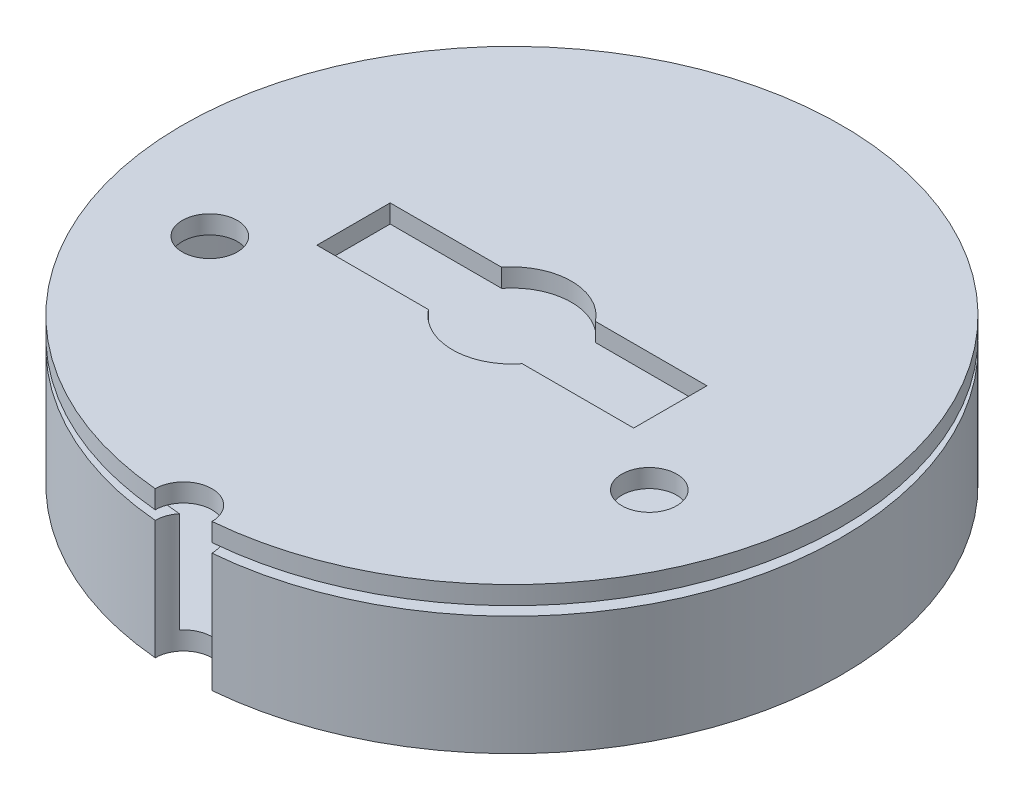
ISO-10303-21;
HEADER;
FILE_DESCRIPTION(('STEP AP214'),'2;1');
FILE_NAME('part.step','',(''),(''),'','','');
FILE_SCHEMA(('AUTOMOTIVE_DESIGN { 1 0 10303 214 1 1 1 1 }'));
ENDSEC;
DATA;
#1=APPLICATION_CONTEXT('core data for automotive mechanical design processes');
#2=APPLICATION_PROTOCOL_DEFINITION('international standard','automotive_design',2000,#1);
#3=PRODUCT_CONTEXT('',#1,'mechanical');
#4=PRODUCT('Part','Part','',(#3));
#5=PRODUCT_RELATED_PRODUCT_CATEGORY('part','',(#4));
#6=PRODUCT_DEFINITION_FORMATION('','',#4);
#7=PRODUCT_DEFINITION_CONTEXT('part definition',#1,'design');
#8=PRODUCT_DEFINITION('design','',#6,#7);
#9=PRODUCT_DEFINITION_SHAPE('','',#8);
#10=(LENGTH_UNIT() NAMED_UNIT(*) SI_UNIT(.MILLI.,.METRE.));
#11=(NAMED_UNIT(*) PLANE_ANGLE_UNIT() SI_UNIT($,.RADIAN.));
#12=(NAMED_UNIT(*) SI_UNIT($,.STERADIAN.) SOLID_ANGLE_UNIT());
#13=UNCERTAINTY_MEASURE_WITH_UNIT(LENGTH_MEASURE(1.E-05),#10,'distance_accuracy_value','');
#14=(GEOMETRIC_REPRESENTATION_CONTEXT(3) GLOBAL_UNCERTAINTY_ASSIGNED_CONTEXT((#13)) GLOBAL_UNIT_ASSIGNED_CONTEXT((#10,
#11,#12)) REPRESENTATION_CONTEXT('',''));
#15=CARTESIAN_POINT('',(0.,0.,0.));
#16=DIRECTION('',(0.,0.,1.));
#17=DIRECTION('',(1.,0.,0.));
#18=AXIS2_PLACEMENT_3D('',#15,#16,#17);
#19=CARTESIAN_POINT('',(0.,20.32,22.7750874367147));
#20=DIRECTION('',(0.,1.,0.));
#21=DIRECTION('',(0.,0.,1.));
#22=AXIS2_PLACEMENT_3D('',#19,#20,#21);
#23=PLANE('',#22);
#24=CARTESIAN_POINT('',(-30.48,20.32,11.43));
#25=DIRECTION('',(0.,1.,0.));
#26=DIRECTION('',(0.,0.,1.));
#27=AXIS2_PLACEMENT_3D('',#24,#25,#26);
#28=CIRCLE('',#27,3.81);
#29=CARTESIAN_POINT('',(-30.48,20.32,15.24));
#30=VERTEX_POINT('',#29);
#31=EDGE_CURVE('E141',#30,#30,#28,.F.);
#32=ORIENTED_EDGE('',*,*,#31,.T.);
#33=EDGE_LOOP('',(#32));
#34=FACE_BOUND('',#33,.T.);
#35=CARTESIAN_POINT('',(30.48,20.32,11.43));
#36=DIRECTION('',(0.,1.,0.));
#37=DIRECTION('',(0.,0.,1.));
#38=AXIS2_PLACEMENT_3D('',#35,#36,#37);
#39=CIRCLE('',#38,3.81);
#40=CARTESIAN_POINT('',(30.48,20.32,15.24));
#41=VERTEX_POINT('',#40);
#42=EDGE_CURVE('E164',#41,#41,#39,.F.);
#43=ORIENTED_EDGE('',*,*,#42,.T.);
#44=EDGE_LOOP('',(#43));
#45=FACE_BOUND('',#44,.T.);
#46=CARTESIAN_POINT('',(0.,20.32,45.5501748734294));
#47=DIRECTION('',(0.,-1.,0.));
#48=DIRECTION('',(0.,0.,1.));
#49=AXIS2_PLACEMENT_3D('',#46,#47,#48);
#50=CIRCLE('',#49,3.937);
#51=CARTESIAN_POINT('',(-3.93700000000001,20.32,45.5501748734294));
#52=VERTEX_POINT('',#51);
#53=CARTESIAN_POINT('',(3.937,20.32,45.5501748734294));
#54=VERTEX_POINT('',#53);
#55=EDGE_CURVE('E208',#52,#54,#50,.T.);
#56=ORIENTED_EDGE('',*,*,#55,.T.);
#57=CARTESIAN_POINT('',(0.,20.32,0.));
#58=DIRECTION('',(0.,1.,0.));
#59=DIRECTION('',(0.,0.,1.));
#60=AXIS2_PLACEMENT_3D('',#57,#58,#59);
#61=CIRCLE('',#60,45.72);
#62=EDGE_CURVE('E144',#54,#52,#61,.T.);
#63=ORIENTED_EDGE('',*,*,#62,.T.);
#64=EDGE_LOOP('',(#56,#63));
#65=FACE_BOUND('',#64,.T.);
#66=CARTESIAN_POINT('',(0.,20.32,0.));
#67=DIRECTION('',(0.,1.,0.));
#68=DIRECTION('',(0.,0.,1.));
#69=AXIS2_PLACEMENT_3D('',#66,#67,#68);
#70=CIRCLE('',#69,8.255);
#71=CARTESIAN_POINT('',(-6.50681373638434,20.32,-5.08));
#72=VERTEX_POINT('',#71);
#73=CARTESIAN_POINT('',(6.50681373638434,20.32,-5.08));
#74=VERTEX_POINT('',#73);
#75=EDGE_CURVE('E156',#72,#74,#70,.F.);
#76=ORIENTED_EDGE('',*,*,#75,.T.);
#77=DIRECTION('',(1.,0.,0.));
#78=VECTOR('',#77,1.);
#79=CARTESIAN_POINT('',(0.,20.32,-5.08));
#80=LINE('',#79,#78);
#81=CARTESIAN_POINT('',(21.971,20.32,-5.08));
#82=VERTEX_POINT('',#81);
#83=EDGE_CURVE('E199',#74,#82,#80,.T.);
#84=ORIENTED_EDGE('',*,*,#83,.T.);
#85=DIRECTION('',(0.,0.,1.));
#86=VECTOR('',#85,1.);
#87=CARTESIAN_POINT('',(21.971,20.32,22.7750874367147));
#88=LINE('',#87,#86);
#89=CARTESIAN_POINT('',(21.971,20.32,5.08));
#90=VERTEX_POINT('',#89);
#91=EDGE_CURVE('E159',#82,#90,#88,.T.);
#92=ORIENTED_EDGE('',*,*,#91,.T.);
#93=DIRECTION('',(-1.,0.,0.));
#94=VECTOR('',#93,1.);
#95=CARTESIAN_POINT('',(0.,20.32,5.08));
#96=LINE('',#95,#94);
#97=CARTESIAN_POINT('',(6.50681373638434,20.32,5.08));
#98=VERTEX_POINT('',#97);
#99=EDGE_CURVE('E190',#90,#98,#96,.T.);
#100=ORIENTED_EDGE('',*,*,#99,.T.);
#101=CARTESIAN_POINT('',(-6.50681373638434,20.32,5.08));
#102=VERTEX_POINT('',#101);
#103=EDGE_CURVE('E134',#98,#102,#70,.F.);
#104=ORIENTED_EDGE('',*,*,#103,.T.);
#105=CARTESIAN_POINT('',(-21.971,20.32,5.08));
#106=VERTEX_POINT('',#105);
#107=EDGE_CURVE('E186',#102,#106,#96,.T.);
#108=ORIENTED_EDGE('',*,*,#107,.T.);
#109=DIRECTION('',(0.,0.,-1.));
#110=VECTOR('',#109,1.);
#111=CARTESIAN_POINT('',(-21.971,20.32,22.7750874367147));
#112=LINE('',#111,#110);
#113=CARTESIAN_POINT('',(-21.971,20.32,-5.08));
#114=VERTEX_POINT('',#113);
#115=EDGE_CURVE('E193',#106,#114,#112,.T.);
#116=ORIENTED_EDGE('',*,*,#115,.T.);
#117=EDGE_CURVE('E203',#114,#72,#80,.T.);
#118=ORIENTED_EDGE('',*,*,#117,.T.);
#119=EDGE_LOOP('',(#76,#84,#92,#100,#104,#108,#116,#118));
#120=FACE_BOUND('',#119,.T.);
#121=ADVANCED_FACE('F46',(#34,#45,#65,#120),#23,.T.);
#122=CARTESIAN_POINT('',(21.971,38.608,5.08));
#123=DIRECTION('',(-1.,0.,0.));
#124=DIRECTION('',(0.,0.,1.));
#125=AXIS2_PLACEMENT_3D('',#122,#123,#124);
#126=PLANE('',#125);
#127=DIRECTION('',(0.,-1.,0.));
#128=VECTOR('',#127,1.);
#129=CARTESIAN_POINT('',(21.971,38.608,-5.08));
#130=LINE('',#129,#128);
#131=CARTESIAN_POINT('',(21.971,17.78,-5.08));
#132=VERTEX_POINT('',#131);
#133=EDGE_CURVE('E182',#82,#132,#130,.T.);
#134=ORIENTED_EDGE('',*,*,#133,.T.);
#135=DIRECTION('',(0.,0.,1.));
#136=VECTOR('',#135,1.);
#137=CARTESIAN_POINT('',(21.971,17.78,0.));
#138=LINE('',#137,#136);
#139=CARTESIAN_POINT('',(21.971,17.78,5.08));
#140=VERTEX_POINT('',#139);
#141=EDGE_CURVE('E55',#132,#140,#138,.T.);
#142=ORIENTED_EDGE('',*,*,#141,.T.);
#143=DIRECTION('',(0.,-1.,0.));
#144=VECTOR('',#143,1.);
#145=CARTESIAN_POINT('',(21.971,38.608,5.08));
#146=LINE('',#145,#144);
#147=EDGE_CURVE('E64',#90,#140,#146,.T.);
#148=ORIENTED_EDGE('',*,*,#147,.F.);
#149=ORIENTED_EDGE('',*,*,#91,.F.);
#150=EDGE_LOOP('',(#134,#142,#148,#149));
#151=FACE_BOUND('',#150,.T.);
#152=ADVANCED_FACE('F212',(#151),#126,.T.);
#153=CARTESIAN_POINT('',(-21.971,38.608,5.08));
#154=DIRECTION('',(0.,0.,-1.));
#155=DIRECTION('',(-1.,0.,0.));
#156=AXIS2_PLACEMENT_3D('',#153,#154,#155);
#157=PLANE('',#156);
#158=ORIENTED_EDGE('',*,*,#147,.T.);
#159=DIRECTION('',(-1.,0.,0.));
#160=VECTOR('',#159,1.);
#161=CARTESIAN_POINT('',(0.,17.78,5.08));
#162=LINE('',#161,#160);
#163=CARTESIAN_POINT('',(6.50681373638435,17.78,5.08));
#164=VERTEX_POINT('',#163);
#165=EDGE_CURVE('E150',#140,#164,#162,.T.);
#166=ORIENTED_EDGE('',*,*,#165,.T.);
#167=DIRECTION('',(0.,-1.,0.));
#168=VECTOR('',#167,1.);
#169=CARTESIAN_POINT('',(6.50681373638434,50.038,5.08));
#170=LINE('',#169,#168);
#171=EDGE_CURVE('E189',#98,#164,#170,.T.);
#172=ORIENTED_EDGE('',*,*,#171,.F.);
#173=ORIENTED_EDGE('',*,*,#99,.F.);
#174=EDGE_LOOP('',(#158,#166,#172,#173));
#175=FACE_BOUND('',#174,.T.);
#176=ADVANCED_FACE('F262',(#175),#157,.T.);
#177=CARTESIAN_POINT('',(0.,50.038,0.));
#178=DIRECTION('',(0.,-1.,0.));
#179=DIRECTION('',(0.,0.,-1.));
#180=AXIS2_PLACEMENT_3D('',#177,#178,#179);
#181=CYLINDRICAL_SURFACE('',#180,8.255);
#182=ORIENTED_EDGE('',*,*,#103,.F.);
#183=ORIENTED_EDGE('',*,*,#171,.T.);
#184=CARTESIAN_POINT('',(0.,17.78,0.));
#185=DIRECTION('',(0.,1.,0.));
#186=DIRECTION('',(0.,0.,1.));
#187=AXIS2_PLACEMENT_3D('',#184,#185,#186);
#188=CIRCLE('',#187,8.255);
#189=CARTESIAN_POINT('',(-6.50681373638435,17.78,5.08));
#190=VERTEX_POINT('',#189);
#191=EDGE_CURVE('E157',#190,#164,#188,.T.);
#192=ORIENTED_EDGE('',*,*,#191,.F.);
#193=DIRECTION('',(0.,-1.,0.));
#194=VECTOR('',#193,1.);
#195=CARTESIAN_POINT('',(-6.50681373638434,50.038,5.08));
#196=LINE('',#195,#194);
#197=EDGE_CURVE('E72',#190,#102,#196,.F.);
#198=ORIENTED_EDGE('',*,*,#197,.T.);
#199=EDGE_LOOP('',(#182,#183,#192,#198));
#200=FACE_BOUND('',#199,.T.);
#201=ADVANCED_FACE('F233',(#200),#181,.F.);
#202=ORIENTED_EDGE('',*,*,#197,.F.);
#203=CARTESIAN_POINT('',(-21.971,17.78,5.08));
#204=VERTEX_POINT('',#203);
#205=EDGE_CURVE('E146',#190,#204,#162,.T.);
#206=ORIENTED_EDGE('',*,*,#205,.T.);
#207=DIRECTION('',(0.,-1.,0.));
#208=VECTOR('',#207,1.);
#209=CARTESIAN_POINT('',(-21.971,38.608,5.08));
#210=LINE('',#209,#208);
#211=EDGE_CURVE('E176',#106,#204,#210,.T.);
#212=ORIENTED_EDGE('',*,*,#211,.F.);
#213=ORIENTED_EDGE('',*,*,#107,.F.);
#214=EDGE_LOOP('',(#202,#206,#212,#213));
#215=FACE_BOUND('',#214,.T.);
#216=ADVANCED_FACE('F237',(#215),#157,.T.);
#217=CARTESIAN_POINT('',(-21.971,38.608,5.08));
#218=DIRECTION('',(1.,0.,0.));
#219=DIRECTION('',(0.,0.,-1.));
#220=AXIS2_PLACEMENT_3D('',#217,#218,#219);
#221=PLANE('',#220);
#222=ORIENTED_EDGE('',*,*,#211,.T.);
#223=DIRECTION('',(0.,0.,-1.));
#224=VECTOR('',#223,1.);
#225=CARTESIAN_POINT('',(-21.971,17.78,0.));
#226=LINE('',#225,#224);
#227=CARTESIAN_POINT('',(-21.971,17.78,-5.08));
#228=VERTEX_POINT('',#227);
#229=EDGE_CURVE('E148',#204,#228,#226,.T.);
#230=ORIENTED_EDGE('',*,*,#229,.T.);
#231=DIRECTION('',(0.,-1.,0.));
#232=VECTOR('',#231,1.);
#233=CARTESIAN_POINT('',(-21.971,38.608,-5.08));
#234=LINE('',#233,#232);
#235=EDGE_CURVE('E179',#114,#228,#234,.T.);
#236=ORIENTED_EDGE('',*,*,#235,.F.);
#237=ORIENTED_EDGE('',*,*,#115,.F.);
#238=EDGE_LOOP('',(#222,#230,#236,#237));
#239=FACE_BOUND('',#238,.T.);
#240=ADVANCED_FACE('F239',(#239),#221,.T.);
#241=CARTESIAN_POINT('',(-21.971,38.608,-5.08));
#242=DIRECTION('',(0.,0.,1.));
#243=DIRECTION('',(1.,0.,0.));
#244=AXIS2_PLACEMENT_3D('',#241,#242,#243);
#245=PLANE('',#244);
#246=ORIENTED_EDGE('',*,*,#235,.T.);
#247=DIRECTION('',(1.,0.,0.));
#248=VECTOR('',#247,1.);
#249=CARTESIAN_POINT('',(0.,17.78,-5.08));
#250=LINE('',#249,#248);
#251=CARTESIAN_POINT('',(-6.50681373638434,17.78,-5.08));
#252=VERTEX_POINT('',#251);
#253=EDGE_CURVE('E57',#228,#252,#250,.T.);
#254=ORIENTED_EDGE('',*,*,#253,.T.);
#255=DIRECTION('',(0.,-1.,0.));
#256=VECTOR('',#255,1.);
#257=CARTESIAN_POINT('',(-6.50681373638434,50.038,-5.08));
#258=LINE('',#257,#256);
#259=EDGE_CURVE('E202',#72,#252,#258,.T.);
#260=ORIENTED_EDGE('',*,*,#259,.F.);
#261=ORIENTED_EDGE('',*,*,#117,.F.);
#262=EDGE_LOOP('',(#246,#254,#260,#261));
#263=FACE_BOUND('',#262,.T.);
#264=ADVANCED_FACE('F242',(#263),#245,.T.);
#265=ORIENTED_EDGE('',*,*,#75,.F.);
#266=ORIENTED_EDGE('',*,*,#259,.T.);
#267=CARTESIAN_POINT('',(6.50681373638434,17.78,-5.08));
#268=VERTEX_POINT('',#267);
#269=EDGE_CURVE('E135',#268,#252,#188,.T.);
#270=ORIENTED_EDGE('',*,*,#269,.F.);
#271=DIRECTION('',(0.,-1.,0.));
#272=VECTOR('',#271,1.);
#273=CARTESIAN_POINT('',(6.50681373638434,50.038,-5.08));
#274=LINE('',#273,#272);
#275=EDGE_CURVE('E196',#268,#74,#274,.F.);
#276=ORIENTED_EDGE('',*,*,#275,.T.);
#277=EDGE_LOOP('',(#265,#266,#270,#276));
#278=FACE_BOUND('',#277,.T.);
#279=ADVANCED_FACE('F219',(#278),#181,.F.);
#280=ORIENTED_EDGE('',*,*,#275,.F.);
#281=EDGE_CURVE('E13',#268,#132,#250,.T.);
#282=ORIENTED_EDGE('',*,*,#281,.T.);
#283=ORIENTED_EDGE('',*,*,#133,.F.);
#284=ORIENTED_EDGE('',*,*,#83,.F.);
#285=EDGE_LOOP('',(#280,#282,#283,#284));
#286=FACE_BOUND('',#285,.T.);
#287=ADVANCED_FACE('F224',(#286),#245,.T.);
#288=CARTESIAN_POINT('',(0.,20.32,0.));
#289=DIRECTION('',(0.,-1.,0.));
#290=DIRECTION('',(0.,0.,-1.));
#291=AXIS2_PLACEMENT_3D('',#288,#289,#290);
#292=CYLINDRICAL_SURFACE('',#291,45.72);
#293=CARTESIAN_POINT('',(0.,17.78,0.));
#294=DIRECTION('',(0.,-1.,0.));
#295=DIRECTION('',(0.,0.,-1.));
#296=AXIS2_PLACEMENT_3D('',#293,#294,#295);
#297=CIRCLE('',#296,45.72);
#298=CARTESIAN_POINT('',(-3.937,17.78,45.5501748734294));
#299=VERTEX_POINT('',#298);
#300=CARTESIAN_POINT('',(3.937,17.78,45.5501748734294));
#301=VERTEX_POINT('',#300);
#302=EDGE_CURVE('E137',#299,#301,#297,.T.);
#303=ORIENTED_EDGE('',*,*,#302,.F.);
#304=DIRECTION('',(0.,-1.,0.));
#305=VECTOR('',#304,1.);
#306=CARTESIAN_POINT('',(-3.93700000000001,20.32,45.5501748734294));
#307=LINE('',#306,#305);
#308=EDGE_CURVE('E131',#52,#299,#307,.T.);
#309=ORIENTED_EDGE('',*,*,#308,.F.);
#310=ORIENTED_EDGE('',*,*,#62,.F.);
#311=DIRECTION('',(0.,-1.,0.));
#312=VECTOR('',#311,1.);
#313=CARTESIAN_POINT('',(3.937,20.32,45.5501748734294));
#314=LINE('',#313,#312);
#315=EDGE_CURVE('E129',#54,#301,#314,.T.);
#316=ORIENTED_EDGE('',*,*,#315,.T.);
#317=EDGE_LOOP('',(#303,#309,#310,#316));
#318=FACE_BOUND('',#317,.T.);
#319=ADVANCED_FACE('F143',(#318),#292,.T.);
#320=CARTESIAN_POINT('',(0.,17.78,0.));
#321=DIRECTION('',(0.,1.,0.));
#322=DIRECTION('',(0.,0.,1.));
#323=AXIS2_PLACEMENT_3D('',#320,#321,#322);
#324=PLANE('',#323);
#325=CARTESIAN_POINT('',(-30.48,17.78,11.43));
#326=DIRECTION('',(0.,1.,0.));
#327=DIRECTION('',(0.,0.,1.));
#328=AXIS2_PLACEMENT_3D('',#325,#326,#327);
#329=CIRCLE('',#328,3.81);
#330=CARTESIAN_POINT('',(-30.48,17.78,15.24));
#331=VERTEX_POINT('',#330);
#332=EDGE_CURVE('E50',#331,#331,#329,.F.);
#333=ORIENTED_EDGE('',*,*,#332,.F.);
#334=EDGE_LOOP('',(#333));
#335=FACE_BOUND('',#334,.T.);
#336=CARTESIAN_POINT('',(30.48,17.78,11.43));
#337=DIRECTION('',(0.,1.,0.));
#338=DIRECTION('',(0.,0.,1.));
#339=AXIS2_PLACEMENT_3D('',#336,#337,#338);
#340=CIRCLE('',#339,3.81);
#341=CARTESIAN_POINT('',(30.48,17.78,15.24));
#342=VERTEX_POINT('',#341);
#343=EDGE_CURVE('E162',#342,#342,#340,.F.);
#344=ORIENTED_EDGE('',*,*,#343,.F.);
#345=EDGE_LOOP('',(#344));
#346=FACE_BOUND('',#345,.T.);
#347=CARTESIAN_POINT('',(0.,17.78,45.5501748734294));
#348=DIRECTION('',(0.,1.,0.));
#349=DIRECTION('',(0.,0.,1.));
#350=AXIS2_PLACEMENT_3D('',#347,#348,#349);
#351=CIRCLE('',#350,3.937);
#352=EDGE_CURVE('E125',#299,#301,#351,.F.);
#353=ORIENTED_EDGE('',*,*,#352,.F.);
#354=ORIENTED_EDGE('',*,*,#302,.T.);
#355=EDGE_LOOP('',(#353,#354));
#356=FACE_BOUND('',#355,.T.);
#357=ORIENTED_EDGE('',*,*,#281,.F.);
#358=ORIENTED_EDGE('',*,*,#269,.T.);
#359=ORIENTED_EDGE('',*,*,#253,.F.);
#360=ORIENTED_EDGE('',*,*,#229,.F.);
#361=ORIENTED_EDGE('',*,*,#205,.F.);
#362=ORIENTED_EDGE('',*,*,#191,.T.);
#363=ORIENTED_EDGE('',*,*,#165,.F.);
#364=ORIENTED_EDGE('',*,*,#141,.F.);
#365=EDGE_LOOP('',(#357,#358,#359,#360,#361,#362,#363,#364));
#366=FACE_BOUND('',#365,.T.);
#367=ADVANCED_FACE('F138',(#335,#346,#356,#366),#324,.F.);
#368=CARTESIAN_POINT('',(0.,20.32,45.5501748734294));
#369=DIRECTION('',(0.,-1.,0.));
#370=DIRECTION('',(0.,0.,-1.));
#371=AXIS2_PLACEMENT_3D('',#368,#369,#370);
#372=CYLINDRICAL_SURFACE('',#371,3.937);
#373=ORIENTED_EDGE('',*,*,#308,.T.);
#374=ORIENTED_EDGE('',*,*,#352,.T.);
#375=ORIENTED_EDGE('',*,*,#315,.F.);
#376=ORIENTED_EDGE('',*,*,#55,.F.);
#377=EDGE_LOOP('',(#373,#374,#375,#376));
#378=FACE_BOUND('',#377,.T.);
#379=ADVANCED_FACE('F48',(#378),#372,.F.);
#380=CARTESIAN_POINT('',(30.48,39.37,11.43));
#381=DIRECTION('',(0.,-1.,0.));
#382=DIRECTION('',(0.,0.,-1.));
#383=AXIS2_PLACEMENT_3D('',#380,#381,#382);
#384=CYLINDRICAL_SURFACE('',#383,3.81);
#385=ORIENTED_EDGE('',*,*,#42,.F.);
#386=EDGE_LOOP('',(#385));
#387=FACE_BOUND('',#386,.T.);
#388=ORIENTED_EDGE('',*,*,#343,.T.);
#389=EDGE_LOOP('',(#388));
#390=FACE_BOUND('',#389,.T.);
#391=ADVANCED_FACE('F316',(#387,#390),#384,.F.);
#392=CARTESIAN_POINT('',(-30.48,39.37,11.43));
#393=DIRECTION('',(0.,-1.,0.));
#394=DIRECTION('',(0.,0.,-1.));
#395=AXIS2_PLACEMENT_3D('',#392,#393,#394);
#396=CYLINDRICAL_SURFACE('',#395,3.81);
#397=ORIENTED_EDGE('',*,*,#31,.F.);
#398=EDGE_LOOP('',(#397));
#399=FACE_BOUND('',#398,.T.);
#400=ORIENTED_EDGE('',*,*,#332,.T.);
#401=EDGE_LOOP('',(#400));
#402=FACE_BOUND('',#401,.T.);
#403=ADVANCED_FACE('F323',(#399,#402),#396,.F.);
#404=CLOSED_SHELL('',(#121,#152,#176,#201,#216,#240,#264,#279,#287,#319,#367,#379,#391,#403));
#405=MANIFOLD_SOLID_BREP('B2',#404);
#406=CARTESIAN_POINT('',(0.,20.32,45.5501748734294));
#407=DIRECTION('',(0.,-1.,0.));
#408=DIRECTION('',(0.,0.,-1.));
#409=AXIS2_PLACEMENT_3D('',#406,#407,#408);
#410=CYLINDRICAL_SURFACE('',#409,3.937);
#411=CARTESIAN_POINT('',(0.,16.51,45.5501748734294));
#412=DIRECTION('',(0.,1.,0.));
#413=DIRECTION('',(0.,0.,1.));
#414=AXIS2_PLACEMENT_3D('',#411,#412,#413);
#415=CIRCLE('',#414,3.937);
#416=CARTESIAN_POINT('',(-3.937,16.51,45.5501748734294));
#417=VERTEX_POINT('',#416);
#418=CARTESIAN_POINT('',(-3.058799887373,16.51,43.0715235770573));
#419=VERTEX_POINT('',#418);
#420=EDGE_CURVE('E378',#417,#419,#415,.F.);
#421=ORIENTED_EDGE('',*,*,#420,.F.);
#422=DIRECTION('',(0.,-1.,0.));
#423=VECTOR('',#422,1.);
#424=CARTESIAN_POINT('',(-3.93700000000001,20.32,45.5501748734294));
#425=LINE('',#424,#423);
#426=CARTESIAN_POINT('',(-3.93700000000001,0.,45.5501748734294));
#427=VERTEX_POINT('',#426);
#428=EDGE_CURVE('E434',#417,#427,#425,.T.);
#429=ORIENTED_EDGE('',*,*,#428,.T.);
#430=CARTESIAN_POINT('',(0.,0.,45.5501748734294));
#431=DIRECTION('',(0.,-1.,0.));
#432=DIRECTION('',(0.,0.,1.));
#433=AXIS2_PLACEMENT_3D('',#430,#431,#432);
#434=CIRCLE('',#433,3.937);
#435=CARTESIAN_POINT('',(3.937,0.,45.5501748734294));
#436=VERTEX_POINT('',#435);
#437=EDGE_CURVE('E423',#427,#436,#434,.T.);
#438=ORIENTED_EDGE('',*,*,#437,.T.);
#439=DIRECTION('',(0.,-1.,0.));
#440=VECTOR('',#439,1.);
#441=CARTESIAN_POINT('',(3.937,20.32,45.5501748734294));
#442=LINE('',#441,#440);
#443=CARTESIAN_POINT('',(3.937,16.51,45.5501748734294));
#444=VERTEX_POINT('',#443);
#445=EDGE_CURVE('E419',#444,#436,#442,.T.);
#446=ORIENTED_EDGE('',*,*,#445,.F.);
#447=CARTESIAN_POINT('',(3.05879988737297,16.51,43.0715235770573));
#448=VERTEX_POINT('',#447);
#449=EDGE_CURVE('E44',#448,#444,#415,.F.);
#450=ORIENTED_EDGE('',*,*,#449,.F.);
#451=DIRECTION('',(0.,1.,0.));
#452=VECTOR('',#451,1.);
#453=CARTESIAN_POINT('',(3.058799887373,10.16,43.0715235770573));
#454=LINE('',#453,#452);
#455=CARTESIAN_POINT('',(3.05879988737294,2.54,43.0715235770573));
#456=VERTEX_POINT('',#455);
#457=EDGE_CURVE('E414',#448,#456,#454,.F.);
#458=ORIENTED_EDGE('',*,*,#457,.T.);
#459=CARTESIAN_POINT('',(0.,2.54,45.5501748734294));
#460=DIRECTION('',(0.,1.,0.));
#461=DIRECTION('',(0.,0.,1.));
#462=AXIS2_PLACEMENT_3D('',#459,#460,#461);
#463=CIRCLE('',#462,3.937);
#464=CARTESIAN_POINT('',(-3.05879988737294,2.54,43.0715235770573));
#465=VERTEX_POINT('',#464);
#466=EDGE_CURVE('E418',#465,#456,#463,.F.);
#467=ORIENTED_EDGE('',*,*,#466,.F.);
#468=DIRECTION('',(0.,1.,0.));
#469=VECTOR('',#468,1.);
#470=CARTESIAN_POINT('',(-3.058799887373,10.16,43.0715235770573));
#471=LINE('',#470,#469);
#472=EDGE_CURVE('E412',#465,#419,#471,.T.);
#473=ORIENTED_EDGE('',*,*,#472,.T.);
#474=EDGE_LOOP('',(#421,#429,#438,#446,#450,#458,#467,#473));
#475=FACE_BOUND('',#474,.T.);
#476=ADVANCED_FACE('F367',(#475),#410,.F.);
#477=CARTESIAN_POINT('',(0.,20.32,0.));
#478=DIRECTION('',(0.,-1.,0.));
#479=DIRECTION('',(0.,0.,-1.));
#480=AXIS2_PLACEMENT_3D('',#477,#478,#479);
#481=CYLINDRICAL_SURFACE('',#480,45.72);
#482=CARTESIAN_POINT('',(0.,16.51,0.));
#483=DIRECTION('',(0.,1.,0.));
#484=DIRECTION('',(0.,0.,1.));
#485=AXIS2_PLACEMENT_3D('',#482,#483,#484);
#486=CIRCLE('',#485,45.72);
#487=EDGE_CURVE('E404',#444,#417,#486,.T.);
#488=ORIENTED_EDGE('',*,*,#487,.F.);
#489=ORIENTED_EDGE('',*,*,#445,.T.);
#490=CARTESIAN_POINT('',(0.,0.,0.));
#491=DIRECTION('',(0.,1.,0.));
#492=DIRECTION('',(0.,0.,1.));
#493=AXIS2_PLACEMENT_3D('',#490,#491,#492);
#494=CIRCLE('',#493,45.72);
#495=EDGE_CURVE('E421',#436,#427,#494,.T.);
#496=ORIENTED_EDGE('',*,*,#495,.T.);
#497=ORIENTED_EDGE('',*,*,#428,.F.);
#498=EDGE_LOOP('',(#488,#489,#496,#497));
#499=FACE_BOUND('',#498,.T.);
#500=ADVANCED_FACE('F480',(#499),#481,.T.);
#501=CARTESIAN_POINT('',(0.,2.54,0.));
#502=DIRECTION('',(0.,1.,0.));
#503=DIRECTION('',(0.,0.,1.));
#504=AXIS2_PLACEMENT_3D('',#501,#502,#503);
#505=CYLINDRICAL_SURFACE('',#504,43.18);
#506=CARTESIAN_POINT('',(0.,16.51,0.));
#507=DIRECTION('',(0.,1.,0.));
#508=DIRECTION('',(0.,0.,1.));
#509=AXIS2_PLACEMENT_3D('',#506,#507,#508);
#510=CIRCLE('',#509,43.18);
#511=EDGE_CURVE('E376',#419,#448,#510,.F.);
#512=ORIENTED_EDGE('',*,*,#511,.F.);
#513=ORIENTED_EDGE('',*,*,#472,.F.);
#514=CARTESIAN_POINT('',(0.,2.54,0.));
#515=DIRECTION('',(0.,1.,0.));
#516=DIRECTION('',(0.,0.,1.));
#517=AXIS2_PLACEMENT_3D('',#514,#515,#516);
#518=CIRCLE('',#517,43.18);
#519=EDGE_CURVE('E438',#456,#465,#518,.T.);
#520=ORIENTED_EDGE('',*,*,#519,.F.);
#521=ORIENTED_EDGE('',*,*,#457,.F.);
#522=EDGE_LOOP('',(#512,#513,#520,#521));
#523=FACE_BOUND('',#522,.T.);
#524=ADVANCED_FACE('F410',(#523),#505,.F.);
#525=CARTESIAN_POINT('',(0.,20.32,0.));
#526=DIRECTION('',(0.,-1.,0.));
#527=DIRECTION('',(0.,0.,-1.));
#528=AXIS2_PLACEMENT_3D('',#525,#526,#527);
#529=CYLINDRICAL_SURFACE('',#528,5.588);
#530=CARTESIAN_POINT('',(0.,0.,0.));
#531=DIRECTION('',(0.,1.,0.));
#532=DIRECTION('',(0.,0.,1.));
#533=AXIS2_PLACEMENT_3D('',#530,#531,#532);
#534=CIRCLE('',#533,5.588);
#535=CARTESIAN_POINT('',(0.,0.,5.588));
#536=VERTEX_POINT('',#535);
#537=EDGE_CURVE('E429',#536,#536,#534,.T.);
#538=ORIENTED_EDGE('',*,*,#537,.F.);
#539=EDGE_LOOP('',(#538));
#540=FACE_BOUND('',#539,.T.);
#541=CARTESIAN_POINT('',(0.,2.54,0.));
#542=DIRECTION('',(0.,1.,0.));
#543=DIRECTION('',(0.,0.,1.));
#544=AXIS2_PLACEMENT_3D('',#541,#542,#543);
#545=CIRCLE('',#544,5.588);
#546=CARTESIAN_POINT('',(0.,2.54,5.588));
#547=VERTEX_POINT('',#546);
#548=EDGE_CURVE('E426',#547,#547,#545,.T.);
#549=ORIENTED_EDGE('',*,*,#548,.T.);
#550=EDGE_LOOP('',(#549));
#551=FACE_BOUND('',#550,.T.);
#552=ADVANCED_FACE('F488',(#540,#551),#529,.F.);
#553=CARTESIAN_POINT('',(0.,0.,22.7750874367147));
#554=DIRECTION('',(0.,1.,0.));
#555=DIRECTION('',(0.,0.,1.));
#556=AXIS2_PLACEMENT_3D('',#553,#554,#555);
#557=PLANE('',#556);
#558=CARTESIAN_POINT('',(-30.48,0.,11.43));
#559=DIRECTION('',(0.,1.,0.));
#560=DIRECTION('',(0.,0.,1.));
#561=AXIS2_PLACEMENT_3D('',#558,#559,#560);
#562=CIRCLE('',#561,3.81);
#563=CARTESIAN_POINT('',(-30.48,0.,15.24));
#564=VERTEX_POINT('',#563);
#565=EDGE_CURVE('E443',#564,#564,#562,.T.);
#566=ORIENTED_EDGE('',*,*,#565,.T.);
#567=EDGE_LOOP('',(#566));
#568=FACE_BOUND('',#567,.T.);
#569=CARTESIAN_POINT('',(30.48,0.,11.43));
#570=DIRECTION('',(0.,1.,0.));
#571=DIRECTION('',(0.,0.,-1.));
#572=AXIS2_PLACEMENT_3D('',#569,#570,#571);
#573=CIRCLE('',#572,3.81);
#574=CARTESIAN_POINT('',(30.48,0.,7.62));
#575=VERTEX_POINT('',#574);
#576=EDGE_CURVE('E448',#575,#575,#573,.T.);
#577=ORIENTED_EDGE('',*,*,#576,.T.);
#578=EDGE_LOOP('',(#577));
#579=FACE_BOUND('',#578,.T.);
#580=ORIENTED_EDGE('',*,*,#437,.F.);
#581=ORIENTED_EDGE('',*,*,#495,.F.);
#582=EDGE_LOOP('',(#580,#581));
#583=FACE_BOUND('',#582,.T.);
#584=ORIENTED_EDGE('',*,*,#537,.T.);
#585=EDGE_LOOP('',(#584));
#586=FACE_BOUND('',#585,.T.);
#587=ADVANCED_FACE('F456',(#568,#579,#583,#586),#557,.F.);
#588=CARTESIAN_POINT('',(0.,2.54,0.));
#589=DIRECTION('',(0.,1.,0.));
#590=DIRECTION('',(0.,0.,1.));
#591=AXIS2_PLACEMENT_3D('',#588,#589,#590);
#592=PLANE('',#591);
#593=CARTESIAN_POINT('',(-30.48,2.54,11.43));
#594=DIRECTION('',(0.,1.,0.));
#595=DIRECTION('',(0.,0.,1.));
#596=AXIS2_PLACEMENT_3D('',#593,#594,#595);
#597=CIRCLE('',#596,3.81);
#598=CARTESIAN_POINT('',(-30.48,2.54,15.24));
#599=VERTEX_POINT('',#598);
#600=EDGE_CURVE('E370',#599,#599,#597,.F.);
#601=ORIENTED_EDGE('',*,*,#600,.T.);
#602=EDGE_LOOP('',(#601));
#603=FACE_BOUND('',#602,.T.);
#604=CARTESIAN_POINT('',(30.48,2.54,11.43));
#605=DIRECTION('',(0.,1.,0.));
#606=DIRECTION('',(0.,0.,1.));
#607=AXIS2_PLACEMENT_3D('',#604,#605,#606);
#608=CIRCLE('',#607,3.81);
#609=CARTESIAN_POINT('',(30.48,2.54,15.24));
#610=VERTEX_POINT('',#609);
#611=EDGE_CURVE('E441',#610,#610,#608,.F.);
#612=ORIENTED_EDGE('',*,*,#611,.T.);
#613=EDGE_LOOP('',(#612));
#614=FACE_BOUND('',#613,.T.);
#615=ORIENTED_EDGE('',*,*,#548,.F.);
#616=EDGE_LOOP('',(#615));
#617=FACE_BOUND('',#616,.T.);
#618=ORIENTED_EDGE('',*,*,#466,.T.);
#619=ORIENTED_EDGE('',*,*,#519,.T.);
#620=EDGE_LOOP('',(#618,#619));
#621=FACE_BOUND('',#620,.T.);
#622=ADVANCED_FACE('F462',(#603,#614,#617,#621),#592,.T.);
#623=CARTESIAN_POINT('',(30.48,39.37,11.43));
#624=DIRECTION('',(0.,-1.,0.));
#625=DIRECTION('',(0.,0.,-1.));
#626=AXIS2_PLACEMENT_3D('',#623,#624,#625);
#627=CYLINDRICAL_SURFACE('',#626,3.81);
#628=ORIENTED_EDGE('',*,*,#611,.F.);
#629=EDGE_LOOP('',(#628));
#630=FACE_BOUND('',#629,.T.);
#631=ORIENTED_EDGE('',*,*,#576,.F.);
#632=EDGE_LOOP('',(#631));
#633=FACE_BOUND('',#632,.T.);
#634=ADVANCED_FACE('F459',(#630,#633),#627,.F.);
#635=CARTESIAN_POINT('',(-30.48,39.37,11.43));
#636=DIRECTION('',(0.,-1.,0.));
#637=DIRECTION('',(0.,0.,-1.));
#638=AXIS2_PLACEMENT_3D('',#635,#636,#637);
#639=CYLINDRICAL_SURFACE('',#638,3.81);
#640=ORIENTED_EDGE('',*,*,#600,.F.);
#641=EDGE_LOOP('',(#640));
#642=FACE_BOUND('',#641,.T.);
#643=ORIENTED_EDGE('',*,*,#565,.F.);
#644=EDGE_LOOP('',(#643));
#645=FACE_BOUND('',#644,.T.);
#646=ADVANCED_FACE('F461',(#642,#645),#639,.F.);
#647=CARTESIAN_POINT('',(72.898,16.51,-55.7376732664433));
#648=DIRECTION('',(0.,1.,0.));
#649=DIRECTION('',(0.,0.,1.));
#650=AXIS2_PLACEMENT_3D('',#647,#648,#649);
#651=PLANE('',#650);
#652=ORIENTED_EDGE('',*,*,#487,.T.);
#653=ORIENTED_EDGE('',*,*,#420,.T.);
#654=ORIENTED_EDGE('',*,*,#511,.T.);
#655=ORIENTED_EDGE('',*,*,#449,.T.);
#656=EDGE_LOOP('',(#652,#653,#654,#655));
#657=FACE_BOUND('',#656,.T.);
#658=ADVANCED_FACE('F403',(#657),#651,.T.);
#659=CLOSED_SHELL('',(#476,#500,#524,#552,#587,#622,#634,#646,#658));
#660=MANIFOLD_SOLID_BREP('B7',#659);
#661=ADVANCED_BREP_SHAPE_REPRESENTATION('',(#18,#405,#660),#14);
#662=SHAPE_DEFINITION_REPRESENTATION(#9,#661);
ENDSEC;
END-ISO-10303-21;
